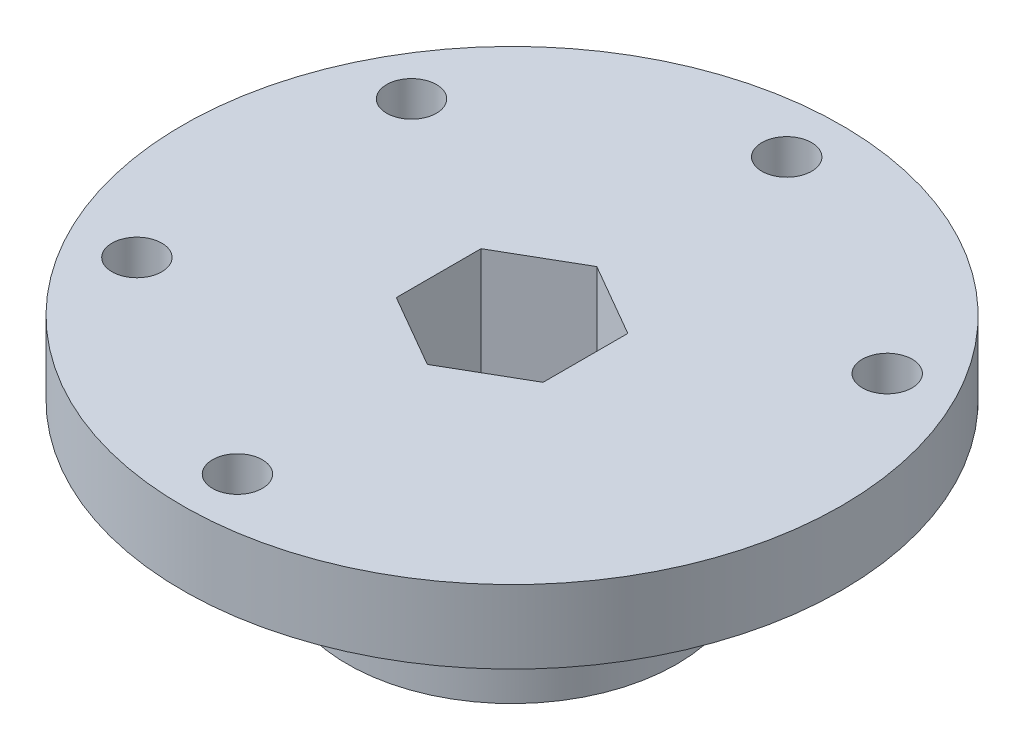
ISO-10303-21;
HEADER;
FILE_DESCRIPTION(('STEP AP214'),'2;1');
FILE_NAME('part.step','',(''),(''),'','','');
FILE_SCHEMA(('AUTOMOTIVE_DESIGN { 1 0 10303 214 1 1 1 1 }'));
ENDSEC;
DATA;
#1=APPLICATION_CONTEXT('core data for automotive mechanical design processes');
#2=APPLICATION_PROTOCOL_DEFINITION('international standard','automotive_design',2000,#1);
#3=PRODUCT_CONTEXT('',#1,'mechanical');
#4=PRODUCT('Part','Part','',(#3));
#5=PRODUCT_RELATED_PRODUCT_CATEGORY('part','',(#4));
#6=PRODUCT_DEFINITION_FORMATION('','',#4);
#7=PRODUCT_DEFINITION_CONTEXT('part definition',#1,'design');
#8=PRODUCT_DEFINITION('design','',#6,#7);
#9=PRODUCT_DEFINITION_SHAPE('','',#8);
#10=(LENGTH_UNIT() NAMED_UNIT(*) SI_UNIT(.MILLI.,.METRE.));
#11=(NAMED_UNIT(*) PLANE_ANGLE_UNIT() SI_UNIT($,.RADIAN.));
#12=(NAMED_UNIT(*) SI_UNIT($,.STERADIAN.) SOLID_ANGLE_UNIT());
#13=UNCERTAINTY_MEASURE_WITH_UNIT(LENGTH_MEASURE(1.E-05),#10,'distance_accuracy_value','');
#14=(GEOMETRIC_REPRESENTATION_CONTEXT(3) GLOBAL_UNCERTAINTY_ASSIGNED_CONTEXT((#13)) GLOBAL_UNIT_ASSIGNED_CONTEXT((#10,
#11,#12)) REPRESENTATION_CONTEXT('',''));
#15=CARTESIAN_POINT('',(0.,0.,0.));
#16=DIRECTION('',(0.,0.,1.));
#17=DIRECTION('',(1.,0.,0.));
#18=AXIS2_PLACEMENT_3D('',#15,#16,#17);
#19=CARTESIAN_POINT('',(0.,0.,0.));
#20=DIRECTION('',(0.,-1.,0.));
#21=DIRECTION('',(1.,0.,0.));
#22=AXIS2_PLACEMENT_3D('',#19,#20,#21);
#23=CYLINDRICAL_SURFACE('',#22,28.575);
#24=CARTESIAN_POINT('',(0.,0.,0.));
#25=DIRECTION('',(0.,-1.,0.));
#26=DIRECTION('',(1.,0.,0.));
#27=AXIS2_PLACEMENT_3D('',#24,#25,#26);
#28=CIRCLE('',#27,28.575);
#29=CARTESIAN_POINT('',(28.575,0.,0.));
#30=VERTEX_POINT('',#29);
#31=EDGE_CURVE('E48',#30,#30,#28,.T.);
#32=ORIENTED_EDGE('',*,*,#31,.T.);
#33=EDGE_LOOP('',(#32));
#34=FACE_BOUND('',#33,.T.);
#35=CARTESIAN_POINT('',(0.,-6.35,0.));
#36=DIRECTION('',(0.,-1.,0.));
#37=DIRECTION('',(1.,0.,0.));
#38=AXIS2_PLACEMENT_3D('',#35,#36,#37);
#39=CIRCLE('',#38,28.575);
#40=CARTESIAN_POINT('',(28.575,-6.35,0.));
#41=VERTEX_POINT('',#40);
#42=EDGE_CURVE('E175',#41,#41,#39,.T.);
#43=ORIENTED_EDGE('',*,*,#42,.F.);
#44=EDGE_LOOP('',(#43));
#45=FACE_BOUND('',#44,.T.);
#46=ADVANCED_FACE('F45',(#34,#45),#23,.T.);
#47=CARTESIAN_POINT('',(28.575,0.,0.));
#48=DIRECTION('',(0.,1.,0.));
#49=DIRECTION('',(-1.,0.,0.));
#50=AXIS2_PLACEMENT_3D('',#47,#48,#49);
#51=PLANE('',#50);
#52=CARTESIAN_POINT('',(0.,0.,23.8125));
#53=DIRECTION('',(0.,-1.,0.));
#54=DIRECTION('',(0.,0.,-1.));
#55=AXIS2_PLACEMENT_3D('',#52,#53,#54);
#56=CIRCLE('',#55,2.15899999999999);
#57=CARTESIAN_POINT('',(0.,0.,21.6535));
#58=VERTEX_POINT('',#57);
#59=EDGE_CURVE('E247',#58,#58,#56,.T.);
#60=ORIENTED_EDGE('',*,*,#59,.T.);
#61=EDGE_LOOP('',(#60));
#62=FACE_BOUND('',#61,.T.);
#63=CARTESIAN_POINT('',(-20.6222299276169,0.,-11.90625));
#64=DIRECTION('',(0.,-1.,0.));
#65=DIRECTION('',(0.,0.,-1.));
#66=AXIS2_PLACEMENT_3D('',#63,#64,#65);
#67=CIRCLE('',#66,2.15899999999999);
#68=CARTESIAN_POINT('',(-20.6222299276169,0.,-14.06525));
#69=VERTEX_POINT('',#68);
#70=EDGE_CURVE('E260',#69,#69,#67,.T.);
#71=ORIENTED_EDGE('',*,*,#70,.T.);
#72=EDGE_LOOP('',(#71));
#73=FACE_BOUND('',#72,.T.);
#74=CARTESIAN_POINT('',(0.,0.,-23.8125));
#75=DIRECTION('',(0.,-1.,0.));
#76=DIRECTION('',(0.,0.,-1.));
#77=AXIS2_PLACEMENT_3D('',#74,#75,#76);
#78=CIRCLE('',#77,2.15899999999999);
#79=CARTESIAN_POINT('',(0.,0.,-25.9715));
#80=VERTEX_POINT('',#79);
#81=EDGE_CURVE('E268',#80,#80,#78,.T.);
#82=ORIENTED_EDGE('',*,*,#81,.T.);
#83=EDGE_LOOP('',(#82));
#84=FACE_BOUND('',#83,.T.);
#85=CARTESIAN_POINT('',(-20.6222299276169,0.,11.90625));
#86=DIRECTION('',(0.,-1.,0.));
#87=DIRECTION('',(0.,0.,-1.));
#88=AXIS2_PLACEMENT_3D('',#85,#86,#87);
#89=CIRCLE('',#88,2.15899999999999);
#90=CARTESIAN_POINT('',(-20.6222299276169,0.,9.74725000000001));
#91=VERTEX_POINT('',#90);
#92=EDGE_CURVE('E276',#91,#91,#89,.T.);
#93=ORIENTED_EDGE('',*,*,#92,.T.);
#94=EDGE_LOOP('',(#93));
#95=FACE_BOUND('',#94,.T.);
#96=CARTESIAN_POINT('',(20.6222299276169,0.,-11.90625));
#97=DIRECTION('',(0.,-1.,0.));
#98=DIRECTION('',(0.,0.,-1.));
#99=AXIS2_PLACEMENT_3D('',#96,#97,#98);
#100=CIRCLE('',#99,2.15899999999999);
#101=CARTESIAN_POINT('',(20.6222299276169,0.,-14.06525));
#102=VERTEX_POINT('',#101);
#103=EDGE_CURVE('E128',#102,#102,#100,.T.);
#104=ORIENTED_EDGE('',*,*,#103,.T.);
#105=EDGE_LOOP('',(#104));
#106=FACE_BOUND('',#105,.T.);
#107=DIRECTION('',(-0.866025403784437,0.,-0.500000000000003));
#108=VECTOR('',#107,1.);
#109=CARTESIAN_POINT('',(6.3627,0.,-3.67350655777282));
#110=LINE('',#109,#108);
#111=CARTESIAN_POINT('',(6.3627,0.,-3.67350655777282));
#112=VERTEX_POINT('',#111);
#113=CARTESIAN_POINT('',(0.,0.,-7.34701311554569));
#114=VERTEX_POINT('',#113);
#115=EDGE_CURVE('E61',#112,#114,#110,.T.);
#116=ORIENTED_EDGE('',*,*,#115,.F.);
#117=DIRECTION('',(0.,0.,-1.));
#118=VECTOR('',#117,1.);
#119=CARTESIAN_POINT('',(6.3627,0.,3.67350655777282));
#120=LINE('',#119,#118);
#121=CARTESIAN_POINT('',(6.3627,0.,3.67350655777282));
#122=VERTEX_POINT('',#121);
#123=EDGE_CURVE('E121',#122,#112,#120,.T.);
#124=ORIENTED_EDGE('',*,*,#123,.F.);
#125=DIRECTION('',(0.866025403784439,0.,-0.5));
#126=VECTOR('',#125,1.);
#127=CARTESIAN_POINT('',(0.,0.,7.34701311554565));
#128=LINE('',#127,#126);
#129=CARTESIAN_POINT('',(0.,0.,7.34701311554565));
#130=VERTEX_POINT('',#129);
#131=EDGE_CURVE('E125',#130,#122,#128,.T.);
#132=ORIENTED_EDGE('',*,*,#131,.F.);
#133=DIRECTION('',(0.866025403784439,0.,0.5));
#134=VECTOR('',#133,1.);
#135=CARTESIAN_POINT('',(-6.3627,0.,3.67350655777282));
#136=LINE('',#135,#134);
#137=CARTESIAN_POINT('',(-6.3627,0.,3.67350655777282));
#138=VERTEX_POINT('',#137);
#139=EDGE_CURVE('E151',#138,#130,#136,.T.);
#140=ORIENTED_EDGE('',*,*,#139,.F.);
#141=DIRECTION('',(0.,0.,1.));
#142=VECTOR('',#141,1.);
#143=CARTESIAN_POINT('',(-6.3627,0.,-3.67350655777282));
#144=LINE('',#143,#142);
#145=CARTESIAN_POINT('',(-6.3627,0.,-3.67350655777282));
#146=VERTEX_POINT('',#145);
#147=EDGE_CURVE('E147',#146,#138,#144,.T.);
#148=ORIENTED_EDGE('',*,*,#147,.F.);
#149=DIRECTION('',(-0.866025403784437,0.,0.500000000000002));
#150=VECTOR('',#149,1.);
#151=CARTESIAN_POINT('',(0.,0.,-7.34701311554568));
#152=LINE('',#151,#150);
#153=EDGE_CURVE('E144',#114,#146,#152,.T.);
#154=ORIENTED_EDGE('',*,*,#153,.F.);
#155=EDGE_LOOP('',(#116,#124,#132,#140,#148,#154));
#156=FACE_BOUND('',#155,.T.);
#157=ORIENTED_EDGE('',*,*,#31,.F.);
#158=EDGE_LOOP('',(#157));
#159=FACE_BOUND('',#158,.T.);
#160=ADVANCED_FACE('F186',(#62,#73,#84,#95,#106,#156,#159),#51,.T.);
#161=CARTESIAN_POINT('',(0.,-6.35,0.));
#162=DIRECTION('',(0.,-1.,0.));
#163=DIRECTION('',(1.,0.,0.));
#164=AXIS2_PLACEMENT_3D('',#161,#162,#163);
#165=PLANE('',#164);
#166=CARTESIAN_POINT('',(0.,-6.35,23.8125));
#167=DIRECTION('',(0.,-1.,0.));
#168=DIRECTION('',(0.,0.,-1.));
#169=AXIS2_PLACEMENT_3D('',#166,#167,#168);
#170=CIRCLE('',#169,2.15899999999999);
#171=CARTESIAN_POINT('',(0.,-6.35,21.6535));
#172=VERTEX_POINT('',#171);
#173=EDGE_CURVE('E250',#172,#172,#170,.T.);
#174=ORIENTED_EDGE('',*,*,#173,.F.);
#175=EDGE_LOOP('',(#174));
#176=FACE_BOUND('',#175,.T.);
#177=CARTESIAN_POINT('',(-20.6222299276169,-6.35,-11.90625));
#178=DIRECTION('',(0.,-1.,0.));
#179=DIRECTION('',(0.,0.,-1.));
#180=AXIS2_PLACEMENT_3D('',#177,#178,#179);
#181=CIRCLE('',#180,2.15899999999999);
#182=CARTESIAN_POINT('',(-20.6222299276169,-6.35,-14.06525));
#183=VERTEX_POINT('',#182);
#184=EDGE_CURVE('E254',#183,#183,#181,.T.);
#185=ORIENTED_EDGE('',*,*,#184,.F.);
#186=EDGE_LOOP('',(#185));
#187=FACE_BOUND('',#186,.T.);
#188=CARTESIAN_POINT('',(0.,-6.35,-23.8125));
#189=DIRECTION('',(0.,-1.,0.));
#190=DIRECTION('',(0.,0.,-1.));
#191=AXIS2_PLACEMENT_3D('',#188,#189,#190);
#192=CIRCLE('',#191,2.15899999999999);
#193=CARTESIAN_POINT('',(0.,-6.35,-25.9715));
#194=VERTEX_POINT('',#193);
#195=EDGE_CURVE('E264',#194,#194,#192,.T.);
#196=ORIENTED_EDGE('',*,*,#195,.F.);
#197=EDGE_LOOP('',(#196));
#198=FACE_BOUND('',#197,.T.);
#199=CARTESIAN_POINT('',(-20.6222299276169,-6.35,11.90625));
#200=DIRECTION('',(0.,-1.,0.));
#201=DIRECTION('',(0.,0.,-1.));
#202=AXIS2_PLACEMENT_3D('',#199,#200,#201);
#203=CIRCLE('',#202,2.15899999999999);
#204=CARTESIAN_POINT('',(-20.6222299276169,-6.35,9.74725000000001));
#205=VERTEX_POINT('',#204);
#206=EDGE_CURVE('E272',#205,#205,#203,.T.);
#207=ORIENTED_EDGE('',*,*,#206,.F.);
#208=EDGE_LOOP('',(#207));
#209=FACE_BOUND('',#208,.T.);
#210=CARTESIAN_POINT('',(20.6222299276169,-6.35,-11.90625));
#211=DIRECTION('',(0.,-1.,0.));
#212=DIRECTION('',(0.,0.,-1.));
#213=AXIS2_PLACEMENT_3D('',#210,#211,#212);
#214=CIRCLE('',#213,2.15899999999999);
#215=CARTESIAN_POINT('',(20.6222299276169,-6.35,-14.06525));
#216=VERTEX_POINT('',#215);
#217=EDGE_CURVE('E279',#216,#216,#214,.T.);
#218=ORIENTED_EDGE('',*,*,#217,.F.);
#219=EDGE_LOOP('',(#218));
#220=FACE_BOUND('',#219,.T.);
#221=CARTESIAN_POINT('',(0.,-6.35,0.));
#222=DIRECTION('',(0.,-1.,0.));
#223=DIRECTION('',(1.,0.,0.));
#224=AXIS2_PLACEMENT_3D('',#221,#222,#223);
#225=CIRCLE('',#224,14.2748);
#226=CARTESIAN_POINT('',(-14.2748,-6.35,0.));
#227=VERTEX_POINT('',#226);
#228=EDGE_CURVE('E11',#227,#227,#225,.T.);
#229=ORIENTED_EDGE('',*,*,#228,.F.);
#230=EDGE_LOOP('',(#229));
#231=FACE_BOUND('',#230,.T.);
#232=ORIENTED_EDGE('',*,*,#42,.T.);
#233=EDGE_LOOP('',(#232));
#234=FACE_BOUND('',#233,.T.);
#235=ADVANCED_FACE('F188',(#176,#187,#198,#209,#220,#231,#234),#165,.T.);
#236=CARTESIAN_POINT('',(0.,-19.05,0.));
#237=DIRECTION('',(0.,1.,0.));
#238=DIRECTION('',(-1.,0.,0.));
#239=AXIS2_PLACEMENT_3D('',#236,#237,#238);
#240=CYLINDRICAL_SURFACE('',#239,14.2748);
#241=CARTESIAN_POINT('',(0.,-19.05,0.));
#242=DIRECTION('',(0.,-1.,0.));
#243=DIRECTION('',(1.,0.,0.));
#244=AXIS2_PLACEMENT_3D('',#241,#242,#243);
#245=CIRCLE('',#244,14.2748);
#246=CARTESIAN_POINT('',(-14.2748,-19.05,0.));
#247=VERTEX_POINT('',#246);
#248=EDGE_CURVE('E161',#247,#247,#245,.T.);
#249=CARTESIAN_POINT('',(-14.2748,-19.05,0.));
#250=CARTESIAN_POINT('',(-14.2748,-18.9177083333333,0.));
#251=CARTESIAN_POINT('',(-14.2748,-18.7854166666667,0.));
#252=CARTESIAN_POINT('',(-14.2748,-18.5208333333333,0.));
#253=CARTESIAN_POINT('',(-14.2748,-18.3885416666667,0.));
#254=CARTESIAN_POINT('',(-14.2748,-18.1239583333333,0.));
#255=CARTESIAN_POINT('',(-14.2748,-17.9916666666667,0.));
#256=CARTESIAN_POINT('',(-14.2748,-17.7270833333333,0.));
#257=CARTESIAN_POINT('',(-14.2748,-17.5947916666667,0.));
#258=CARTESIAN_POINT('',(-14.2748,-17.3302083333333,0.));
#259=CARTESIAN_POINT('',(-14.2748,-17.1979166666667,0.));
#260=CARTESIAN_POINT('',(-14.2748,-16.9333333333333,0.));
#261=CARTESIAN_POINT('',(-14.2748,-16.8010416666667,0.));
#262=CARTESIAN_POINT('',(-14.2748,-16.5364583333333,0.));
#263=CARTESIAN_POINT('',(-14.2748,-16.4041666666667,0.));
#264=CARTESIAN_POINT('',(-14.2748,-16.1395833333333,0.));
#265=CARTESIAN_POINT('',(-14.2748,-16.0072916666667,0.));
#266=CARTESIAN_POINT('',(-14.2748,-15.7427083333333,0.));
#267=CARTESIAN_POINT('',(-14.2748,-15.6104166666667,0.));
#268=CARTESIAN_POINT('',(-14.2748,-15.3458333333333,0.));
#269=CARTESIAN_POINT('',(-14.2748,-15.2135416666667,0.));
#270=CARTESIAN_POINT('',(-14.2748,-14.9489583333333,0.));
#271=CARTESIAN_POINT('',(-14.2748,-14.8166666666667,0.));
#272=CARTESIAN_POINT('',(-14.2748,-14.5520833333333,0.));
#273=CARTESIAN_POINT('',(-14.2748,-14.4197916666667,0.));
#274=CARTESIAN_POINT('',(-14.2748,-14.1552083333333,0.));
#275=CARTESIAN_POINT('',(-14.2748,-14.0229166666667,0.));
#276=CARTESIAN_POINT('',(-14.2748,-13.7583333333333,0.));
#277=CARTESIAN_POINT('',(-14.2748,-13.6260416666667,0.));
#278=CARTESIAN_POINT('',(-14.2748,-13.3614583333333,0.));
#279=CARTESIAN_POINT('',(-14.2748,-13.2291666666667,0.));
#280=CARTESIAN_POINT('',(-14.2748,-12.9645833333333,0.));
#281=CARTESIAN_POINT('',(-14.2748,-12.8322916666667,0.));
#282=CARTESIAN_POINT('',(-14.2748,-12.5677083333333,0.));
#283=CARTESIAN_POINT('',(-14.2748,-12.4354166666667,0.));
#284=CARTESIAN_POINT('',(-14.2748,-12.1708333333333,0.));
#285=CARTESIAN_POINT('',(-14.2748,-12.0385416666667,0.));
#286=CARTESIAN_POINT('',(-14.2748,-11.7739583333333,0.));
#287=CARTESIAN_POINT('',(-14.2748,-11.6416666666667,0.));
#288=CARTESIAN_POINT('',(-14.2748,-11.3770833333333,0.));
#289=CARTESIAN_POINT('',(-14.2748,-11.2447916666667,0.));
#290=CARTESIAN_POINT('',(-14.2748,-10.9802083333333,0.));
#291=CARTESIAN_POINT('',(-14.2748,-10.8479166666667,0.));
#292=CARTESIAN_POINT('',(-14.2748,-10.5833333333333,0.));
#293=CARTESIAN_POINT('',(-14.2748,-10.4510416666667,0.));
#294=CARTESIAN_POINT('',(-14.2748,-10.1864583333333,0.));
#295=CARTESIAN_POINT('',(-14.2748,-10.0541666666667,0.));
#296=CARTESIAN_POINT('',(-14.2748,-9.78958333333333,0.));
#297=CARTESIAN_POINT('',(-14.2748,-9.65729166666667,0.));
#298=CARTESIAN_POINT('',(-14.2748,-9.39270833333333,0.));
#299=CARTESIAN_POINT('',(-14.2748,-9.26041666666667,0.));
#300=CARTESIAN_POINT('',(-14.2748,-8.99583333333334,0.));
#301=CARTESIAN_POINT('',(-14.2748,-8.86354166666667,0.));
#302=CARTESIAN_POINT('',(-14.2748,-8.59895833333333,0.));
#303=CARTESIAN_POINT('',(-14.2748,-8.46666666666667,0.));
#304=CARTESIAN_POINT('',(-14.2748,-8.20208333333333,0.));
#305=CARTESIAN_POINT('',(-14.2748,-8.06979166666667,0.));
#306=CARTESIAN_POINT('',(-14.2748,-7.80520833333333,0.));
#307=CARTESIAN_POINT('',(-14.2748,-7.67291666666667,0.));
#308=CARTESIAN_POINT('',(-14.2748,-7.40833333333333,0.));
#309=CARTESIAN_POINT('',(-14.2748,-7.27604166666667,0.));
#310=CARTESIAN_POINT('',(-14.2748,-7.01145833333333,0.));
#311=CARTESIAN_POINT('',(-14.2748,-6.87916666666667,0.));
#312=CARTESIAN_POINT('',(-14.2748,-6.61458333333333,0.));
#313=CARTESIAN_POINT('',(-14.2748,-6.48229166666667,0.));
#314=CARTESIAN_POINT('',(-14.2748,-6.35,0.));
#315=B_SPLINE_CURVE_WITH_KNOTS('',3,(#249,#250,#251,#252,#253,#254,#255,#256,#257,#258,#259,
#260,#261,#262,#263,#264,#265,#266,#267,#268,#269,#270,#271,#272,#273,#274,#275,#276,#277,#278,
#279,#280,#281,#282,#283,#284,#285,#286,#287,#288,#289,#290,#291,#292,#293,#294,#295,#296,#297,
#298,#299,#300,#301,#302,#303,#304,#305,#306,#307,#308,#309,#310,#311,#312,#313,#314),
.UNSPECIFIED.,.F.,.F.,(4,2,2,2,2,2,2,2,2,2,2,2,2,2,2,2,2,2,2,2,2,2,2,2,2,2,2,2,2,2,2,2,4),(0.,
0.396874999999998,0.793749999999999,1.190625,1.5875,1.984375,2.38125,2.778125,3.175,3.571875,
3.96875,4.365625,4.7625,5.159375,5.55625,5.953125,6.35,6.746875,7.14375,7.540625,7.9375,
8.334375,8.73125,9.128125,9.525,9.921875,10.31875,10.715625,11.1125,11.509375,11.90625,
12.303125,12.7),.UNSPECIFIED.);
#316=EDGE_CURVE('BSEAM194',#247,#227,#315,.T.);
#317=ORIENTED_EDGE('',*,*,#248,.F.);
#318=ORIENTED_EDGE('',*,*,#228,.T.);
#319=ORIENTED_EDGE('',*,*,#316,.T.);
#320=ORIENTED_EDGE('',*,*,#316,.F.);
#321=EDGE_LOOP('',(#317,#319,#318,#320));
#322=FACE_BOUND('',#321,.T.);
#323=ADVANCED_FACE('F194',(#322),#240,.T.);
#324=CARTESIAN_POINT('',(0.,-19.05,0.));
#325=DIRECTION('',(0.,-1.,0.));
#326=DIRECTION('',(1.,0.,0.));
#327=AXIS2_PLACEMENT_3D('',#324,#325,#326);
#328=PLANE('',#327);
#329=DIRECTION('',(-0.866025403784437,0.,-0.500000000000003));
#330=VECTOR('',#329,1.);
#331=CARTESIAN_POINT('',(6.3627,-19.05,-3.67350655777282));
#332=LINE('',#331,#330);
#333=CARTESIAN_POINT('',(6.3627,-19.05,-3.67350655777282));
#334=VERTEX_POINT('',#333);
#335=CARTESIAN_POINT('',(0.,-19.05,-7.34701311554568));
#336=VERTEX_POINT('',#335);
#337=EDGE_CURVE('E101',#334,#336,#332,.T.);
#338=ORIENTED_EDGE('',*,*,#337,.T.);
#339=DIRECTION('',(-0.866025403784437,0.,0.500000000000002));
#340=VECTOR('',#339,1.);
#341=CARTESIAN_POINT('',(0.,-19.05,-7.34701311554568));
#342=LINE('',#341,#340);
#343=CARTESIAN_POINT('',(-6.3627,-19.05,-3.67350655777282));
#344=VERTEX_POINT('',#343);
#345=EDGE_CURVE('E111',#336,#344,#342,.T.);
#346=ORIENTED_EDGE('',*,*,#345,.T.);
#347=DIRECTION('',(0.,0.,1.));
#348=VECTOR('',#347,1.);
#349=CARTESIAN_POINT('',(-6.3627,-19.05,-3.67350655777282));
#350=LINE('',#349,#348);
#351=CARTESIAN_POINT('',(-6.3627,-19.05,3.67350655777282));
#352=VERTEX_POINT('',#351);
#353=EDGE_CURVE('E69',#344,#352,#350,.T.);
#354=ORIENTED_EDGE('',*,*,#353,.T.);
#355=DIRECTION('',(0.866025403784439,0.,0.5));
#356=VECTOR('',#355,1.);
#357=CARTESIAN_POINT('',(-6.3627,-19.05,3.67350655777282));
#358=LINE('',#357,#356);
#359=CARTESIAN_POINT('',(0.,-19.05,7.34701311554565));
#360=VERTEX_POINT('',#359);
#361=EDGE_CURVE('E133',#352,#360,#358,.T.);
#362=ORIENTED_EDGE('',*,*,#361,.T.);
#363=DIRECTION('',(0.866025403784439,0.,-0.5));
#364=VECTOR('',#363,1.);
#365=CARTESIAN_POINT('',(0.,-19.05,7.34701311554565));
#366=LINE('',#365,#364);
#367=CARTESIAN_POINT('',(6.3627,-19.05,3.67350655777282));
#368=VERTEX_POINT('',#367);
#369=EDGE_CURVE('E137',#360,#368,#366,.T.);
#370=ORIENTED_EDGE('',*,*,#369,.T.);
#371=DIRECTION('',(0.,0.,-1.));
#372=VECTOR('',#371,1.);
#373=CARTESIAN_POINT('',(6.3627,-19.05,3.67350655777282));
#374=LINE('',#373,#372);
#375=EDGE_CURVE('E108',#368,#334,#374,.T.);
#376=ORIENTED_EDGE('',*,*,#375,.T.);
#377=EDGE_LOOP('',(#338,#346,#354,#362,#370,#376));
#378=FACE_BOUND('',#377,.T.);
#379=ORIENTED_EDGE('',*,*,#248,.T.);
#380=EDGE_LOOP('',(#379));
#381=FACE_BOUND('',#380,.T.);
#382=ADVANCED_FACE('F116',(#378,#381),#328,.T.);
#383=CARTESIAN_POINT('',(6.3627,-19.05,-3.67350655777282));
#384=DIRECTION('',(0.500000000000003,0.,-0.866025403784437));
#385=DIRECTION('',(-0.866025403784437,0.,-0.500000000000004));
#386=AXIS2_PLACEMENT_3D('',#383,#384,#385);
#387=PLANE('',#386);
#388=ORIENTED_EDGE('',*,*,#115,.T.);
#389=DIRECTION('',(0.,1.,0.));
#390=VECTOR('',#389,1.);
#391=CARTESIAN_POINT('',(0.,-19.05,-7.34701311554568));
#392=LINE('',#391,#390);
#393=EDGE_CURVE('E97',#336,#114,#392,.T.);
#394=ORIENTED_EDGE('',*,*,#393,.F.);
#395=ORIENTED_EDGE('',*,*,#337,.F.);
#396=DIRECTION('',(0.,1.,0.));
#397=VECTOR('',#396,1.);
#398=CARTESIAN_POINT('',(6.3627,-19.05,-3.67350655777282));
#399=LINE('',#398,#397);
#400=EDGE_CURVE('E158',#334,#112,#399,.T.);
#401=ORIENTED_EDGE('',*,*,#400,.T.);
#402=EDGE_LOOP('',(#388,#394,#395,#401));
#403=FACE_BOUND('',#402,.T.);
#404=ADVANCED_FACE('F99',(#403),#387,.F.);
#405=CARTESIAN_POINT('',(6.3627,-19.05,3.67350655777282));
#406=DIRECTION('',(1.,0.,0.));
#407=DIRECTION('',(0.,1.,0.));
#408=AXIS2_PLACEMENT_3D('',#405,#406,#407);
#409=PLANE('',#408);
#410=ORIENTED_EDGE('',*,*,#123,.T.);
#411=ORIENTED_EDGE('',*,*,#400,.F.);
#412=ORIENTED_EDGE('',*,*,#375,.F.);
#413=DIRECTION('',(0.,1.,0.));
#414=VECTOR('',#413,1.);
#415=CARTESIAN_POINT('',(6.3627,-19.05,3.67350655777282));
#416=LINE('',#415,#414);
#417=EDGE_CURVE('E162',#368,#122,#416,.T.);
#418=ORIENTED_EDGE('',*,*,#417,.T.);
#419=EDGE_LOOP('',(#410,#411,#412,#418));
#420=FACE_BOUND('',#419,.T.);
#421=ADVANCED_FACE('F208',(#420),#409,.F.);
#422=CARTESIAN_POINT('',(0.,-19.05,7.34701311554565));
#423=DIRECTION('',(0.5,0.,0.866025403784439));
#424=DIRECTION('',(0.866025403784439,0.,-0.5));
#425=AXIS2_PLACEMENT_3D('',#422,#423,#424);
#426=PLANE('',#425);
#427=ORIENTED_EDGE('',*,*,#131,.T.);
#428=ORIENTED_EDGE('',*,*,#417,.F.);
#429=ORIENTED_EDGE('',*,*,#369,.F.);
#430=DIRECTION('',(0.,1.,0.));
#431=VECTOR('',#430,1.);
#432=CARTESIAN_POINT('',(0.,-19.05,7.34701311554565));
#433=LINE('',#432,#431);
#434=EDGE_CURVE('E165',#360,#130,#433,.T.);
#435=ORIENTED_EDGE('',*,*,#434,.T.);
#436=EDGE_LOOP('',(#427,#428,#429,#435));
#437=FACE_BOUND('',#436,.T.);
#438=ADVANCED_FACE('F217',(#437),#426,.F.);
#439=CARTESIAN_POINT('',(-6.3627,-19.05,3.67350655777282));
#440=DIRECTION('',(-0.5,0.,0.866025403784439));
#441=DIRECTION('',(0.866025403784439,0.,0.5));
#442=AXIS2_PLACEMENT_3D('',#439,#440,#441);
#443=PLANE('',#442);
#444=ORIENTED_EDGE('',*,*,#139,.T.);
#445=ORIENTED_EDGE('',*,*,#434,.F.);
#446=ORIENTED_EDGE('',*,*,#361,.F.);
#447=DIRECTION('',(0.,1.,0.));
#448=VECTOR('',#447,1.);
#449=CARTESIAN_POINT('',(-6.3627,-19.05,3.67350655777282));
#450=LINE('',#449,#448);
#451=EDGE_CURVE('E168',#352,#138,#450,.T.);
#452=ORIENTED_EDGE('',*,*,#451,.T.);
#453=EDGE_LOOP('',(#444,#445,#446,#452));
#454=FACE_BOUND('',#453,.T.);
#455=ADVANCED_FACE('F214',(#454),#443,.F.);
#456=CARTESIAN_POINT('',(-6.3627,-19.05,-3.67350655777282));
#457=DIRECTION('',(-1.,0.,0.));
#458=DIRECTION('',(0.,-1.,0.));
#459=AXIS2_PLACEMENT_3D('',#456,#457,#458);
#460=PLANE('',#459);
#461=ORIENTED_EDGE('',*,*,#147,.T.);
#462=ORIENTED_EDGE('',*,*,#451,.F.);
#463=ORIENTED_EDGE('',*,*,#353,.F.);
#464=DIRECTION('',(0.,1.,0.));
#465=VECTOR('',#464,1.);
#466=CARTESIAN_POINT('',(-6.3627,-19.05,-3.67350655777282));
#467=LINE('',#466,#465);
#468=EDGE_CURVE('E107',#344,#146,#467,.T.);
#469=ORIENTED_EDGE('',*,*,#468,.T.);
#470=EDGE_LOOP('',(#461,#462,#463,#469));
#471=FACE_BOUND('',#470,.T.);
#472=ADVANCED_FACE('F211',(#471),#460,.F.);
#473=CARTESIAN_POINT('',(0.,-19.05,-7.34701311554568));
#474=DIRECTION('',(-0.500000000000002,0.,-0.866025403784437));
#475=DIRECTION('',(-0.866025403784437,0.,0.500000000000002));
#476=AXIS2_PLACEMENT_3D('',#473,#474,#475);
#477=PLANE('',#476);
#478=ORIENTED_EDGE('',*,*,#153,.T.);
#479=ORIENTED_EDGE('',*,*,#468,.F.);
#480=ORIENTED_EDGE('',*,*,#345,.F.);
#481=ORIENTED_EDGE('',*,*,#393,.T.);
#482=EDGE_LOOP('',(#478,#479,#480,#481));
#483=FACE_BOUND('',#482,.T.);
#484=ADVANCED_FACE('F112',(#483),#477,.F.);
#485=CARTESIAN_POINT('',(20.6222299276169,-6.35,-11.90625));
#486=DIRECTION('',(0.,-1.,0.));
#487=DIRECTION('',(0.,0.,-1.));
#488=AXIS2_PLACEMENT_3D('',#485,#486,#487);
#489=CYLINDRICAL_SURFACE('',#488,2.15899999999999);
#490=ORIENTED_EDGE('',*,*,#103,.F.);
#491=EDGE_LOOP('',(#490));
#492=FACE_BOUND('',#491,.T.);
#493=ORIENTED_EDGE('',*,*,#217,.T.);
#494=EDGE_LOOP('',(#493));
#495=FACE_BOUND('',#494,.T.);
#496=ADVANCED_FACE('F210',(#492,#495),#489,.F.);
#497=CARTESIAN_POINT('',(-20.6222299276169,-6.35,11.90625));
#498=DIRECTION('',(0.,-1.,0.));
#499=DIRECTION('',(0.,0.,-1.));
#500=AXIS2_PLACEMENT_3D('',#497,#498,#499);
#501=CYLINDRICAL_SURFACE('',#500,2.15899999999999);
#502=ORIENTED_EDGE('',*,*,#92,.F.);
#503=EDGE_LOOP('',(#502));
#504=FACE_BOUND('',#503,.T.);
#505=ORIENTED_EDGE('',*,*,#206,.T.);
#506=EDGE_LOOP('',(#505));
#507=FACE_BOUND('',#506,.T.);
#508=ADVANCED_FACE('F227',(#504,#507),#501,.F.);
#509=CARTESIAN_POINT('',(0.,-6.35,-23.8125));
#510=DIRECTION('',(0.,-1.,0.));
#511=DIRECTION('',(0.,0.,-1.));
#512=AXIS2_PLACEMENT_3D('',#509,#510,#511);
#513=CYLINDRICAL_SURFACE('',#512,2.15899999999999);
#514=ORIENTED_EDGE('',*,*,#81,.F.);
#515=EDGE_LOOP('',(#514));
#516=FACE_BOUND('',#515,.T.);
#517=ORIENTED_EDGE('',*,*,#195,.T.);
#518=EDGE_LOOP('',(#517));
#519=FACE_BOUND('',#518,.T.);
#520=ADVANCED_FACE('F231',(#516,#519),#513,.F.);
#521=CARTESIAN_POINT('',(-20.6222299276169,-6.35,-11.90625));
#522=DIRECTION('',(0.,-1.,0.));
#523=DIRECTION('',(0.,0.,-1.));
#524=AXIS2_PLACEMENT_3D('',#521,#522,#523);
#525=CYLINDRICAL_SURFACE('',#524,2.15899999999999);
#526=ORIENTED_EDGE('',*,*,#70,.F.);
#527=EDGE_LOOP('',(#526));
#528=FACE_BOUND('',#527,.T.);
#529=ORIENTED_EDGE('',*,*,#184,.T.);
#530=EDGE_LOOP('',(#529));
#531=FACE_BOUND('',#530,.T.);
#532=ADVANCED_FACE('F235',(#528,#531),#525,.F.);
#533=CARTESIAN_POINT('',(0.,-6.35,23.8125));
#534=DIRECTION('',(0.,-1.,0.));
#535=DIRECTION('',(0.,0.,-1.));
#536=AXIS2_PLACEMENT_3D('',#533,#534,#535);
#537=CYLINDRICAL_SURFACE('',#536,2.15899999999999);
#538=ORIENTED_EDGE('',*,*,#59,.F.);
#539=EDGE_LOOP('',(#538));
#540=FACE_BOUND('',#539,.T.);
#541=ORIENTED_EDGE('',*,*,#173,.T.);
#542=EDGE_LOOP('',(#541));
#543=FACE_BOUND('',#542,.T.);
#544=ADVANCED_FACE('F239',(#540,#543),#537,.F.);
#545=CLOSED_SHELL('',(#46,#160,#235,#323,#382,#404,#421,#438,#455,#472,#484,#496,#508,#520,#532,#544));
#546=MANIFOLD_SOLID_BREP('B2',#545);
#547=ADVANCED_BREP_SHAPE_REPRESENTATION('',(#18,#546),#14);
#548=SHAPE_DEFINITION_REPRESENTATION(#9,#547);
ENDSEC;
END-ISO-10303-21;
